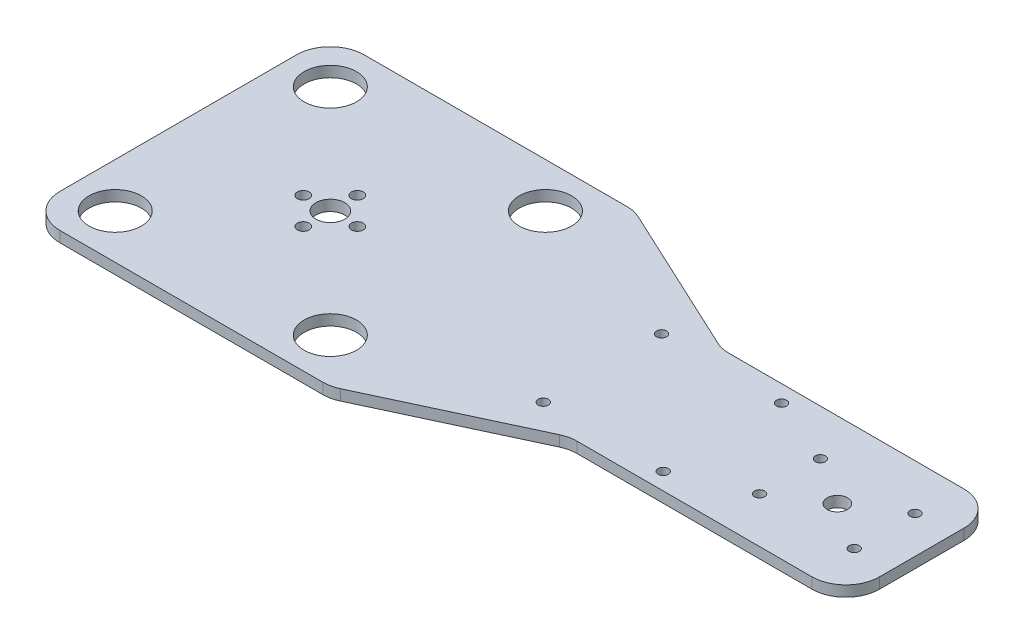
ISO-10303-21;
HEADER;
FILE_DESCRIPTION(('STEP AP214'),'2;1');
FILE_NAME('part.step','',(''),(''),'','','');
FILE_SCHEMA(('AUTOMOTIVE_DESIGN { 1 0 10303 214 1 1 1 1 }'));
ENDSEC;
DATA;
#1=APPLICATION_CONTEXT('core data for automotive mechanical design processes');
#2=APPLICATION_PROTOCOL_DEFINITION('international standard','automotive_design',2000,#1);
#3=PRODUCT_CONTEXT('',#1,'mechanical');
#4=PRODUCT('Part','Part','',(#3));
#5=PRODUCT_RELATED_PRODUCT_CATEGORY('part','',(#4));
#6=PRODUCT_DEFINITION_FORMATION('','',#4);
#7=PRODUCT_DEFINITION_CONTEXT('part definition',#1,'design');
#8=PRODUCT_DEFINITION('design','',#6,#7);
#9=PRODUCT_DEFINITION_SHAPE('','',#8);
#10=(LENGTH_UNIT() NAMED_UNIT(*) SI_UNIT(.MILLI.,.METRE.));
#11=(NAMED_UNIT(*) PLANE_ANGLE_UNIT() SI_UNIT($,.RADIAN.));
#12=(NAMED_UNIT(*) SI_UNIT($,.STERADIAN.) SOLID_ANGLE_UNIT());
#13=UNCERTAINTY_MEASURE_WITH_UNIT(LENGTH_MEASURE(1.E-05),#10,'distance_accuracy_value','');
#14=(GEOMETRIC_REPRESENTATION_CONTEXT(3) GLOBAL_UNCERTAINTY_ASSIGNED_CONTEXT((#13)) GLOBAL_UNIT_ASSIGNED_CONTEXT((#10,
#11,#12)) REPRESENTATION_CONTEXT('',''));
#15=CARTESIAN_POINT('',(0.,0.,0.));
#16=DIRECTION('',(0.,0.,1.));
#17=DIRECTION('',(1.,0.,0.));
#18=AXIS2_PLACEMENT_3D('',#15,#16,#17);
#19=CARTESIAN_POINT('',(93.2514057114654,3.175,22.5));
#20=DIRECTION('',(0.,0.,-1.));
#21=DIRECTION('',(-1.,0.,0.));
#22=AXIS2_PLACEMENT_3D('',#19,#20,#21);
#23=PLANE('',#22);
#24=DIRECTION('',(1.,0.,0.));
#25=VECTOR('',#24,1.);
#26=CARTESIAN_POINT('',(93.2514057114654,3.175,22.5));
#27=LINE('',#26,#25);
#28=CARTESIAN_POINT('',(95.4683523378948,3.175,22.5));
#29=VERTEX_POINT('',#28);
#30=CARTESIAN_POINT('',(165.,3.175,22.5));
#31=VERTEX_POINT('',#30);
#32=EDGE_CURVE('E196',#29,#31,#27,.T.);
#33=ORIENTED_EDGE('',*,*,#32,.F.);
#34=DIRECTION('',(0.,-1.,0.));
#35=VECTOR('',#34,1.);
#36=CARTESIAN_POINT('',(95.4683523378948,0.,22.5));
#37=LINE('',#36,#35);
#38=CARTESIAN_POINT('',(95.4683523378948,0.,22.5));
#39=VERTEX_POINT('',#38);
#40=EDGE_CURVE('E247',#29,#39,#37,.T.);
#41=ORIENTED_EDGE('',*,*,#40,.T.);
#42=DIRECTION('',(1.,0.,0.));
#43=VECTOR('',#42,1.);
#44=CARTESIAN_POINT('',(93.2514057114654,0.,22.5));
#45=LINE('',#44,#43);
#46=CARTESIAN_POINT('',(165.,0.,22.5));
#47=VERTEX_POINT('',#46);
#48=EDGE_CURVE('E184',#39,#47,#45,.T.);
#49=ORIENTED_EDGE('',*,*,#48,.T.);
#50=DIRECTION('',(0.,-1.,0.));
#51=VECTOR('',#50,1.);
#52=CARTESIAN_POINT('',(165.,3.175,22.5));
#53=LINE('',#52,#51);
#54=EDGE_CURVE('E215',#47,#31,#53,.F.);
#55=ORIENTED_EDGE('',*,*,#54,.T.);
#56=EDGE_LOOP('',(#33,#41,#49,#55));
#57=FACE_BOUND('',#56,.T.);
#58=ADVANCED_FACE('F37',(#57),#23,.F.);
#59=CARTESIAN_POINT('',(175.,3.175,-22.5));
#60=DIRECTION('',(-1.,0.,0.));
#61=DIRECTION('',(0.,0.,1.));
#62=AXIS2_PLACEMENT_3D('',#59,#60,#61);
#63=PLANE('',#62);
#64=DIRECTION('',(0.,0.,-1.));
#65=VECTOR('',#64,1.);
#66=CARTESIAN_POINT('',(175.,0.,-22.5));
#67=LINE('',#66,#65);
#68=CARTESIAN_POINT('',(175.,0.,12.5));
#69=VERTEX_POINT('',#68);
#70=CARTESIAN_POINT('',(175.,0.,-12.5));
#71=VERTEX_POINT('',#70);
#72=EDGE_CURVE('E179',#69,#71,#67,.T.);
#73=ORIENTED_EDGE('',*,*,#72,.T.);
#74=DIRECTION('',(0.,-1.,0.));
#75=VECTOR('',#74,1.);
#76=CARTESIAN_POINT('',(175.,3.175,-12.5));
#77=LINE('',#76,#75);
#78=CARTESIAN_POINT('',(175.,3.175,-12.5));
#79=VERTEX_POINT('',#78);
#80=EDGE_CURVE('E155',#71,#79,#77,.F.);
#81=ORIENTED_EDGE('',*,*,#80,.T.);
#82=DIRECTION('',(0.,0.,-1.));
#83=VECTOR('',#82,1.);
#84=CARTESIAN_POINT('',(175.,3.175,-22.5));
#85=LINE('',#84,#83);
#86=CARTESIAN_POINT('',(175.,3.175,12.5));
#87=VERTEX_POINT('',#86);
#88=EDGE_CURVE('E268',#87,#79,#85,.T.);
#89=ORIENTED_EDGE('',*,*,#88,.F.);
#90=DIRECTION('',(0.,-1.,0.));
#91=VECTOR('',#90,1.);
#92=CARTESIAN_POINT('',(175.,3.175,12.5));
#93=LINE('',#92,#91);
#94=EDGE_CURVE('E160',#87,#69,#93,.T.);
#95=ORIENTED_EDGE('',*,*,#94,.T.);
#96=EDGE_LOOP('',(#73,#81,#89,#95));
#97=FACE_BOUND('',#96,.T.);
#98=ADVANCED_FACE('F487',(#97),#63,.F.);
#99=CARTESIAN_POINT('',(93.2514057114654,3.175,-22.5));
#100=DIRECTION('',(0.,0.,1.));
#101=DIRECTION('',(1.,0.,0.));
#102=AXIS2_PLACEMENT_3D('',#99,#100,#101);
#103=PLANE('',#102);
#104=DIRECTION('',(-1.,0.,0.));
#105=VECTOR('',#104,1.);
#106=CARTESIAN_POINT('',(93.2514057114654,0.,-22.5));
#107=LINE('',#106,#105);
#108=CARTESIAN_POINT('',(165.,0.,-22.5));
#109=VERTEX_POINT('',#108);
#110=CARTESIAN_POINT('',(95.4683523378947,0.,-22.5));
#111=VERTEX_POINT('',#110);
#112=EDGE_CURVE('E167',#109,#111,#107,.T.);
#113=ORIENTED_EDGE('',*,*,#112,.T.);
#114=DIRECTION('',(0.,-1.,0.));
#115=VECTOR('',#114,1.);
#116=CARTESIAN_POINT('',(95.4683523378947,3.175,-22.5));
#117=LINE('',#116,#115);
#118=CARTESIAN_POINT('',(95.4683523378947,3.175,-22.5));
#119=VERTEX_POINT('',#118);
#120=EDGE_CURVE('E245',#111,#119,#117,.F.);
#121=ORIENTED_EDGE('',*,*,#120,.T.);
#122=DIRECTION('',(-1.,0.,0.));
#123=VECTOR('',#122,1.);
#124=CARTESIAN_POINT('',(93.2514057114654,3.175,-22.5));
#125=LINE('',#124,#123);
#126=CARTESIAN_POINT('',(165.,3.175,-22.5));
#127=VERTEX_POINT('',#126);
#128=EDGE_CURVE('E170',#127,#119,#125,.T.);
#129=ORIENTED_EDGE('',*,*,#128,.F.);
#130=DIRECTION('',(0.,-1.,0.));
#131=VECTOR('',#130,1.);
#132=CARTESIAN_POINT('',(165.,3.175,-22.5));
#133=LINE('',#132,#131);
#134=EDGE_CURVE('E154',#127,#109,#133,.T.);
#135=ORIENTED_EDGE('',*,*,#134,.T.);
#136=EDGE_LOOP('',(#113,#121,#129,#135));
#137=FACE_BOUND('',#136,.T.);
#138=ADVANCED_FACE('F166',(#137),#103,.F.);
#139=CARTESIAN_POINT('',(45.,3.175,-45.));
#140=DIRECTION('',(-0.422618261740697,0.,0.906307787036651));
#141=DIRECTION('',(0.906307787036651,0.,0.422618261740697));
#142=AXIS2_PLACEMENT_3D('',#139,#140,#141);
#143=PLANE('',#142);
#144=DIRECTION('',(-0.906307787036651,0.,-0.422618261740697));
#145=VECTOR('',#144,1.);
#146=CARTESIAN_POINT('',(45.,0.,-45.));
#147=LINE('',#146,#145);
#148=CARTESIAN_POINT('',(91.2421697204878,0.,-23.4369221296335));
#149=VERTEX_POINT('',#148);
#150=CARTESIAN_POINT('',(47.0092359909776,0.,-44.0630778703665));
#151=VERTEX_POINT('',#150);
#152=EDGE_CURVE('E178',#149,#151,#147,.T.);
#153=ORIENTED_EDGE('',*,*,#152,.T.);
#154=DIRECTION('',(0.,-1.,0.));
#155=VECTOR('',#154,1.);
#156=CARTESIAN_POINT('',(47.0092359909776,3.175,-44.0630778703665));
#157=LINE('',#156,#155);
#158=CARTESIAN_POINT('',(47.0092359909776,3.175,-44.0630778703665));
#159=VERTEX_POINT('',#158);
#160=EDGE_CURVE('E239',#151,#159,#157,.F.);
#161=ORIENTED_EDGE('',*,*,#160,.T.);
#162=DIRECTION('',(-0.906307787036651,0.,-0.422618261740697));
#163=VECTOR('',#162,1.);
#164=CARTESIAN_POINT('',(45.,3.175,-45.));
#165=LINE('',#164,#163);
#166=CARTESIAN_POINT('',(91.2421697204878,3.175,-23.4369221296335));
#167=VERTEX_POINT('',#166);
#168=EDGE_CURVE('E277',#167,#159,#165,.T.);
#169=ORIENTED_EDGE('',*,*,#168,.F.);
#170=DIRECTION('',(0.,-1.,0.));
#171=VECTOR('',#170,1.);
#172=CARTESIAN_POINT('',(91.2421697204878,0.,-23.4369221296335));
#173=LINE('',#172,#171);
#174=EDGE_CURVE('E236',#167,#149,#173,.T.);
#175=ORIENTED_EDGE('',*,*,#174,.T.);
#176=EDGE_LOOP('',(#153,#161,#169,#175));
#177=FACE_BOUND('',#176,.T.);
#178=ADVANCED_FACE('F513',(#177),#143,.F.);
#179=CARTESIAN_POINT('',(-45.,3.175,-45.));
#180=DIRECTION('',(0.,0.,1.));
#181=DIRECTION('',(1.,0.,0.));
#182=AXIS2_PLACEMENT_3D('',#179,#180,#181);
#183=PLANE('',#182);
#184=DIRECTION('',(-1.,0.,0.));
#185=VECTOR('',#184,1.);
#186=CARTESIAN_POINT('',(-45.,3.175,-45.));
#187=LINE('',#186,#185);
#188=CARTESIAN_POINT('',(42.7830533735706,3.175,-45.));
#189=VERTEX_POINT('',#188);
#190=CARTESIAN_POINT('',(-35.,3.175,-45.));
#191=VERTEX_POINT('',#190);
#192=EDGE_CURVE('E280',#189,#191,#187,.T.);
#193=ORIENTED_EDGE('',*,*,#192,.F.);
#194=DIRECTION('',(0.,-1.,0.));
#195=VECTOR('',#194,1.);
#196=CARTESIAN_POINT('',(42.7830533735706,3.175,-45.));
#197=LINE('',#196,#195);
#198=CARTESIAN_POINT('',(42.7830533735706,0.,-45.));
#199=VERTEX_POINT('',#198);
#200=EDGE_CURVE('E229',#189,#199,#197,.T.);
#201=ORIENTED_EDGE('',*,*,#200,.T.);
#202=DIRECTION('',(-1.,0.,0.));
#203=VECTOR('',#202,1.);
#204=CARTESIAN_POINT('',(-45.,0.,-45.));
#205=LINE('',#204,#203);
#206=CARTESIAN_POINT('',(-35.,0.,-45.));
#207=VERTEX_POINT('',#206);
#208=EDGE_CURVE('E182',#199,#207,#205,.T.);
#209=ORIENTED_EDGE('',*,*,#208,.T.);
#210=DIRECTION('',(0.,-1.,0.));
#211=VECTOR('',#210,1.);
#212=CARTESIAN_POINT('',(-35.,3.175,-45.));
#213=LINE('',#212,#211);
#214=EDGE_CURVE('E223',#207,#191,#213,.F.);
#215=ORIENTED_EDGE('',*,*,#214,.T.);
#216=EDGE_LOOP('',(#193,#201,#209,#215));
#217=FACE_BOUND('',#216,.T.);
#218=ADVANCED_FACE('F454',(#217),#183,.F.);
#219=CARTESIAN_POINT('',(-45.,3.175,45.));
#220=DIRECTION('',(1.,0.,0.));
#221=DIRECTION('',(0.,0.,-1.));
#222=AXIS2_PLACEMENT_3D('',#219,#220,#221);
#223=PLANE('',#222);
#224=DIRECTION('',(0.,0.,1.));
#225=VECTOR('',#224,1.);
#226=CARTESIAN_POINT('',(-45.,3.175,45.));
#227=LINE('',#226,#225);
#228=CARTESIAN_POINT('',(-45.,3.175,-35.));
#229=VERTEX_POINT('',#228);
#230=CARTESIAN_POINT('',(-45.,3.175,35.));
#231=VERTEX_POINT('',#230);
#232=EDGE_CURVE('E282',#229,#231,#227,.T.);
#233=ORIENTED_EDGE('',*,*,#232,.F.);
#234=DIRECTION('',(0.,-1.,0.));
#235=VECTOR('',#234,1.);
#236=CARTESIAN_POINT('',(-45.,3.175,-35.));
#237=LINE('',#236,#235);
#238=CARTESIAN_POINT('',(-45.,0.,-35.));
#239=VERTEX_POINT('',#238);
#240=EDGE_CURVE('E220',#229,#239,#237,.T.);
#241=ORIENTED_EDGE('',*,*,#240,.T.);
#242=DIRECTION('',(0.,0.,1.));
#243=VECTOR('',#242,1.);
#244=CARTESIAN_POINT('',(-45.,0.,45.));
#245=LINE('',#244,#243);
#246=CARTESIAN_POINT('',(-45.,0.,35.));
#247=VERTEX_POINT('',#246);
#248=EDGE_CURVE('E189',#239,#247,#245,.T.);
#249=ORIENTED_EDGE('',*,*,#248,.T.);
#250=DIRECTION('',(0.,-1.,0.));
#251=VECTOR('',#250,1.);
#252=CARTESIAN_POINT('',(-45.,3.175,35.));
#253=LINE('',#252,#251);
#254=EDGE_CURVE('E218',#247,#231,#253,.F.);
#255=ORIENTED_EDGE('',*,*,#254,.T.);
#256=EDGE_LOOP('',(#233,#241,#249,#255));
#257=FACE_BOUND('',#256,.T.);
#258=ADVANCED_FACE('F464',(#257),#223,.F.);
#259=CARTESIAN_POINT('',(-45.,3.175,45.));
#260=DIRECTION('',(0.,0.,-1.));
#261=DIRECTION('',(-1.,0.,0.));
#262=AXIS2_PLACEMENT_3D('',#259,#260,#261);
#263=PLANE('',#262);
#264=DIRECTION('',(1.,0.,0.));
#265=VECTOR('',#264,1.);
#266=CARTESIAN_POINT('',(-45.,0.,45.));
#267=LINE('',#266,#265);
#268=CARTESIAN_POINT('',(-35.,0.,45.));
#269=VERTEX_POINT('',#268);
#270=CARTESIAN_POINT('',(42.7830533735706,0.,45.));
#271=VERTEX_POINT('',#270);
#272=EDGE_CURVE('E192',#269,#271,#267,.T.);
#273=ORIENTED_EDGE('',*,*,#272,.T.);
#274=DIRECTION('',(0.,-1.,0.));
#275=VECTOR('',#274,1.);
#276=CARTESIAN_POINT('',(42.7830533735706,3.175,45.));
#277=LINE('',#276,#275);
#278=CARTESIAN_POINT('',(42.7830533735706,3.175,45.));
#279=VERTEX_POINT('',#278);
#280=EDGE_CURVE('E254',#271,#279,#277,.F.);
#281=ORIENTED_EDGE('',*,*,#280,.T.);
#282=DIRECTION('',(1.,0.,0.));
#283=VECTOR('',#282,1.);
#284=CARTESIAN_POINT('',(-45.,3.175,45.));
#285=LINE('',#284,#283);
#286=CARTESIAN_POINT('',(-35.,3.175,45.));
#287=VERTEX_POINT('',#286);
#288=EDGE_CURVE('E285',#287,#279,#285,.T.);
#289=ORIENTED_EDGE('',*,*,#288,.F.);
#290=DIRECTION('',(0.,-1.,0.));
#291=VECTOR('',#290,1.);
#292=CARTESIAN_POINT('',(-35.,3.175,45.));
#293=LINE('',#292,#291);
#294=EDGE_CURVE('E226',#287,#269,#293,.T.);
#295=ORIENTED_EDGE('',*,*,#294,.T.);
#296=EDGE_LOOP('',(#273,#281,#289,#295));
#297=FACE_BOUND('',#296,.T.);
#298=ADVANCED_FACE('F472',(#297),#263,.F.);
#299=CARTESIAN_POINT('',(45.,3.175,45.));
#300=DIRECTION('',(-0.422618261740697,0.,-0.906307787036651));
#301=DIRECTION('',(-0.906307787036651,0.,0.422618261740697));
#302=AXIS2_PLACEMENT_3D('',#299,#300,#301);
#303=PLANE('',#302);
#304=DIRECTION('',(0.906307787036651,0.,-0.422618261740697));
#305=VECTOR('',#304,1.);
#306=CARTESIAN_POINT('',(45.,0.,45.));
#307=LINE('',#306,#305);
#308=CARTESIAN_POINT('',(47.0092359909776,0.,44.0630778703665));
#309=VERTEX_POINT('',#308);
#310=CARTESIAN_POINT('',(91.2421697204878,0.,23.4369221296335));
#311=VERTEX_POINT('',#310);
#312=EDGE_CURVE('E195',#309,#311,#307,.T.);
#313=ORIENTED_EDGE('',*,*,#312,.T.);
#314=DIRECTION('',(0.,-1.,0.));
#315=VECTOR('',#314,1.);
#316=CARTESIAN_POINT('',(91.2421697204878,3.175,23.4369221296335));
#317=LINE('',#316,#315);
#318=CARTESIAN_POINT('',(91.2421697204878,3.175,23.4369221296335));
#319=VERTEX_POINT('',#318);
#320=EDGE_CURVE('E58',#311,#319,#317,.F.);
#321=ORIENTED_EDGE('',*,*,#320,.T.);
#322=DIRECTION('',(0.906307787036651,0.,-0.422618261740697));
#323=VECTOR('',#322,1.);
#324=CARTESIAN_POINT('',(45.,3.175,45.));
#325=LINE('',#324,#323);
#326=CARTESIAN_POINT('',(47.0092359909776,3.175,44.0630778703665));
#327=VERTEX_POINT('',#326);
#328=EDGE_CURVE('E172',#327,#319,#325,.T.);
#329=ORIENTED_EDGE('',*,*,#328,.F.);
#330=DIRECTION('',(0.,-1.,0.));
#331=VECTOR('',#330,1.);
#332=CARTESIAN_POINT('',(47.0092359909776,3.175,44.0630778703665));
#333=LINE('',#332,#331);
#334=EDGE_CURVE('E250',#327,#309,#333,.T.);
#335=ORIENTED_EDGE('',*,*,#334,.T.);
#336=EDGE_LOOP('',(#313,#321,#329,#335));
#337=FACE_BOUND('',#336,.T.);
#338=ADVANCED_FACE('F262',(#337),#303,.F.);
#339=CARTESIAN_POINT('',(0.,3.175,0.));
#340=DIRECTION('',(0.,-1.,0.));
#341=DIRECTION('',(0.,0.,-1.));
#342=AXIS2_PLACEMENT_3D('',#339,#340,#341);
#343=PLANE('',#342);
#344=CARTESIAN_POINT('',(8.,3.175,0.));
#345=DIRECTION('',(0.,1.,0.));
#346=DIRECTION('',(0.,0.,1.));
#347=AXIS2_PLACEMENT_3D('',#344,#345,#346);
#348=CIRCLE('',#347,1.75);
#349=CARTESIAN_POINT('',(8.,3.175,1.75));
#350=VERTEX_POINT('',#349);
#351=EDGE_CURVE('E391',#350,#350,#348,.T.);
#352=ORIENTED_EDGE('',*,*,#351,.F.);
#353=EDGE_LOOP('',(#352));
#354=FACE_BOUND('',#353,.T.);
#355=CARTESIAN_POINT('',(0.,3.175,8.));
#356=DIRECTION('',(0.,1.,0.));
#357=DIRECTION('',(0.,0.,1.));
#358=AXIS2_PLACEMENT_3D('',#355,#356,#357);
#359=CIRCLE('',#358,1.75);
#360=CARTESIAN_POINT('',(0.,3.175,9.75));
#361=VERTEX_POINT('',#360);
#362=EDGE_CURVE('E385',#361,#361,#359,.T.);
#363=ORIENTED_EDGE('',*,*,#362,.F.);
#364=EDGE_LOOP('',(#363));
#365=FACE_BOUND('',#364,.T.);
#366=CARTESIAN_POINT('',(-8.,3.175,0.));
#367=DIRECTION('',(0.,1.,0.));
#368=DIRECTION('',(0.,0.,1.));
#369=AXIS2_PLACEMENT_3D('',#366,#367,#368);
#370=CIRCLE('',#369,1.75);
#371=CARTESIAN_POINT('',(-8.,3.175,1.74999999999994));
#372=VERTEX_POINT('',#371);
#373=EDGE_CURVE('E379',#372,#372,#370,.T.);
#374=ORIENTED_EDGE('',*,*,#373,.F.);
#375=EDGE_LOOP('',(#374));
#376=FACE_BOUND('',#375,.T.);
#377=CARTESIAN_POINT('',(0.,3.175,-8.));
#378=DIRECTION('',(0.,1.,0.));
#379=DIRECTION('',(0.,0.,1.));
#380=AXIS2_PLACEMENT_3D('',#377,#378,#379);
#381=CIRCLE('',#380,1.75);
#382=CARTESIAN_POINT('',(0.,3.175,-6.25));
#383=VERTEX_POINT('',#382);
#384=EDGE_CURVE('E373',#383,#383,#381,.T.);
#385=ORIENTED_EDGE('',*,*,#384,.F.);
#386=EDGE_LOOP('',(#385));
#387=FACE_BOUND('',#386,.T.);
#388=CARTESIAN_POINT('',(-31.8198051533946,3.175,31.8198051533945));
#389=DIRECTION('',(0.,1.,0.));
#390=DIRECTION('',(0.,0.,1.));
#391=AXIS2_PLACEMENT_3D('',#388,#389,#390);
#392=CIRCLE('',#391,7.75);
#393=CARTESIAN_POINT('',(-31.8198051533946,3.175,39.5698051533945));
#394=VERTEX_POINT('',#393);
#395=EDGE_CURVE('E355',#394,#394,#392,.T.);
#396=ORIENTED_EDGE('',*,*,#395,.F.);
#397=EDGE_LOOP('',(#396));
#398=FACE_BOUND('',#397,.T.);
#399=CARTESIAN_POINT('',(31.8198051533945,3.175,31.8198051533948));
#400=DIRECTION('',(0.,1.,0.));
#401=DIRECTION('',(0.,0.,1.));
#402=AXIS2_PLACEMENT_3D('',#399,#400,#401);
#403=CIRCLE('',#402,7.75);
#404=CARTESIAN_POINT('',(31.8198051533945,3.175,39.5698051533948));
#405=VERTEX_POINT('',#404);
#406=EDGE_CURVE('E362',#405,#405,#403,.T.);
#407=ORIENTED_EDGE('',*,*,#406,.F.);
#408=EDGE_LOOP('',(#407));
#409=FACE_BOUND('',#408,.T.);
#410=CARTESIAN_POINT('',(31.8198051533948,3.175,-31.8198051533946));
#411=DIRECTION('',(0.,1.,0.));
#412=DIRECTION('',(0.,0.,1.));
#413=AXIS2_PLACEMENT_3D('',#410,#411,#412);
#414=CIRCLE('',#413,7.75);
#415=CARTESIAN_POINT('',(31.8198051533948,3.175,-24.0698051533946));
#416=VERTEX_POINT('',#415);
#417=EDGE_CURVE('E368',#416,#416,#414,.T.);
#418=ORIENTED_EDGE('',*,*,#417,.F.);
#419=EDGE_LOOP('',(#418));
#420=FACE_BOUND('',#419,.T.);
#421=CARTESIAN_POINT('',(-31.8198051533945,3.175,-31.8198051533948));
#422=DIRECTION('',(0.,1.,0.));
#423=DIRECTION('',(0.,0.,1.));
#424=AXIS2_PLACEMENT_3D('',#421,#422,#423);
#425=CIRCLE('',#424,7.75);
#426=CARTESIAN_POINT('',(-31.8198051533945,3.175,-24.0698051533948));
#427=VERTEX_POINT('',#426);
#428=EDGE_CURVE('E349',#427,#427,#425,.T.);
#429=ORIENTED_EDGE('',*,*,#428,.F.);
#430=EDGE_LOOP('',(#429));
#431=FACE_BOUND('',#430,.T.);
#432=CARTESIAN_POINT('',(80.5,3.175,-17.5));
#433=DIRECTION('',(0.,1.,0.));
#434=DIRECTION('',(0.,0.,-1.));
#435=AXIS2_PLACEMENT_3D('',#432,#433,#434);
#436=CIRCLE('',#435,1.5);
#437=CARTESIAN_POINT('',(80.5,3.175,-19.));
#438=VERTEX_POINT('',#437);
#439=EDGE_CURVE('E331',#438,#438,#436,.T.);
#440=ORIENTED_EDGE('',*,*,#439,.F.);
#441=EDGE_LOOP('',(#440));
#442=FACE_BOUND('',#441,.T.);
#443=CARTESIAN_POINT('',(116.,3.175,-17.5));
#444=DIRECTION('',(0.,1.,0.));
#445=DIRECTION('',(0.,0.,-1.));
#446=AXIS2_PLACEMENT_3D('',#443,#444,#445);
#447=CIRCLE('',#446,1.5);
#448=CARTESIAN_POINT('',(116.,3.175,-19.));
#449=VERTEX_POINT('',#448);
#450=EDGE_CURVE('E338',#449,#449,#447,.T.);
#451=ORIENTED_EDGE('',*,*,#450,.F.);
#452=EDGE_LOOP('',(#451));
#453=FACE_BOUND('',#452,.T.);
#454=CARTESIAN_POINT('',(116.,3.175,17.5));
#455=DIRECTION('',(0.,1.,0.));
#456=DIRECTION('',(0.,0.,1.));
#457=AXIS2_PLACEMENT_3D('',#454,#455,#456);
#458=CIRCLE('',#457,1.5);
#459=CARTESIAN_POINT('',(116.,3.175,19.));
#460=VERTEX_POINT('',#459);
#461=EDGE_CURVE('E344',#460,#460,#458,.T.);
#462=ORIENTED_EDGE('',*,*,#461,.F.);
#463=EDGE_LOOP('',(#462));
#464=FACE_BOUND('',#463,.T.);
#465=CARTESIAN_POINT('',(80.5,3.175,17.5));
#466=DIRECTION('',(0.,1.,0.));
#467=DIRECTION('',(0.,0.,1.));
#468=AXIS2_PLACEMENT_3D('',#465,#466,#467);
#469=CIRCLE('',#468,1.5);
#470=CARTESIAN_POINT('',(80.5,3.175,19.));
#471=VERTEX_POINT('',#470);
#472=EDGE_CURVE('E325',#471,#471,#469,.T.);
#473=ORIENTED_EDGE('',*,*,#472,.F.);
#474=EDGE_LOOP('',(#473));
#475=FACE_BOUND('',#474,.T.);
#476=CARTESIAN_POINT('',(0.,3.175,0.));
#477=DIRECTION('',(0.,1.,0.));
#478=DIRECTION('',(0.,0.,1.));
#479=AXIS2_PLACEMENT_3D('',#476,#477,#478);
#480=CIRCLE('',#479,4.25);
#481=CARTESIAN_POINT('',(0.,3.175,4.25));
#482=VERTEX_POINT('',#481);
#483=EDGE_CURVE('E319',#482,#482,#480,.T.);
#484=ORIENTED_EDGE('',*,*,#483,.F.);
#485=EDGE_LOOP('',(#484));
#486=FACE_BOUND('',#485,.T.);
#487=CARTESIAN_POINT('',(136.,3.175,9.));
#488=DIRECTION('',(0.,1.,0.));
#489=DIRECTION('',(0.,0.,-1.));
#490=AXIS2_PLACEMENT_3D('',#487,#488,#489);
#491=CIRCLE('',#490,1.5);
#492=CARTESIAN_POINT('',(136.,3.175,7.5));
#493=VERTEX_POINT('',#492);
#494=EDGE_CURVE('E295',#493,#493,#491,.T.);
#495=ORIENTED_EDGE('',*,*,#494,.F.);
#496=EDGE_LOOP('',(#495));
#497=FACE_BOUND('',#496,.T.);
#498=CARTESIAN_POINT('',(164.,3.175,9.));
#499=DIRECTION('',(0.,1.,0.));
#500=DIRECTION('',(0.,0.,1.));
#501=AXIS2_PLACEMENT_3D('',#498,#499,#500);
#502=CIRCLE('',#501,1.50000000000003);
#503=CARTESIAN_POINT('',(164.,3.175,10.5));
#504=VERTEX_POINT('',#503);
#505=EDGE_CURVE('E302',#504,#504,#502,.T.);
#506=ORIENTED_EDGE('',*,*,#505,.F.);
#507=EDGE_LOOP('',(#506));
#508=FACE_BOUND('',#507,.T.);
#509=CARTESIAN_POINT('',(164.,3.175,-9.));
#510=DIRECTION('',(0.,1.,0.));
#511=DIRECTION('',(0.,0.,-1.));
#512=AXIS2_PLACEMENT_3D('',#509,#510,#511);
#513=CIRCLE('',#512,1.50000000000003);
#514=CARTESIAN_POINT('',(164.,3.175,-10.5));
#515=VERTEX_POINT('',#514);
#516=EDGE_CURVE('E308',#515,#515,#513,.T.);
#517=ORIENTED_EDGE('',*,*,#516,.F.);
#518=EDGE_LOOP('',(#517));
#519=FACE_BOUND('',#518,.T.);
#520=CARTESIAN_POINT('',(136.,3.175,-9.));
#521=DIRECTION('',(0.,1.,0.));
#522=DIRECTION('',(0.,0.,1.));
#523=AXIS2_PLACEMENT_3D('',#520,#521,#522);
#524=CIRCLE('',#523,1.5);
#525=CARTESIAN_POINT('',(136.,3.175,-7.5));
#526=VERTEX_POINT('',#525);
#527=EDGE_CURVE('E314',#526,#526,#524,.T.);
#528=ORIENTED_EDGE('',*,*,#527,.F.);
#529=EDGE_LOOP('',(#528));
#530=FACE_BOUND('',#529,.T.);
#531=CARTESIAN_POINT('',(150.,3.175,0.));
#532=DIRECTION('',(0.,1.,0.));
#533=DIRECTION('',(0.,0.,1.));
#534=AXIS2_PLACEMENT_3D('',#531,#532,#533);
#535=CIRCLE('',#534,2.99999999999999);
#536=CARTESIAN_POINT('',(150.,3.175,2.99999999999999));
#537=VERTEX_POINT('',#536);
#538=EDGE_CURVE('E273',#537,#537,#535,.T.);
#539=ORIENTED_EDGE('',*,*,#538,.F.);
#540=EDGE_LOOP('',(#539));
#541=FACE_BOUND('',#540,.T.);
#542=ORIENTED_EDGE('',*,*,#168,.T.);
#543=CARTESIAN_POINT('',(42.7830533735706,3.175,-35.));
#544=DIRECTION('',(0.,-1.,0.));
#545=DIRECTION('',(0.,0.,-1.));
#546=AXIS2_PLACEMENT_3D('',#543,#544,#545);
#547=CIRCLE('',#546,10.);
#548=EDGE_CURVE('E243',#159,#189,#547,.F.);
#549=ORIENTED_EDGE('',*,*,#548,.T.);
#550=ORIENTED_EDGE('',*,*,#192,.T.);
#551=CARTESIAN_POINT('',(-35.,3.175,-35.));
#552=DIRECTION('',(0.,-1.,0.));
#553=DIRECTION('',(0.,0.,-1.));
#554=AXIS2_PLACEMENT_3D('',#551,#552,#553);
#555=CIRCLE('',#554,10.);
#556=EDGE_CURVE('E209',#191,#229,#555,.F.);
#557=ORIENTED_EDGE('',*,*,#556,.T.);
#558=ORIENTED_EDGE('',*,*,#232,.T.);
#559=CARTESIAN_POINT('',(-35.,3.175,35.));
#560=DIRECTION('',(0.,-1.,0.));
#561=DIRECTION('',(0.,0.,-1.));
#562=AXIS2_PLACEMENT_3D('',#559,#560,#561);
#563=CIRCLE('',#562,10.);
#564=EDGE_CURVE('E207',#231,#287,#563,.F.);
#565=ORIENTED_EDGE('',*,*,#564,.T.);
#566=ORIENTED_EDGE('',*,*,#288,.T.);
#567=CARTESIAN_POINT('',(42.7830533735706,3.175,35.));
#568=DIRECTION('',(0.,-1.,0.));
#569=DIRECTION('',(0.,0.,-1.));
#570=AXIS2_PLACEMENT_3D('',#567,#568,#569);
#571=CIRCLE('',#570,10.);
#572=EDGE_CURVE('E241',#279,#327,#571,.F.);
#573=ORIENTED_EDGE('',*,*,#572,.T.);
#574=ORIENTED_EDGE('',*,*,#328,.T.);
#575=CARTESIAN_POINT('',(95.4683523378948,3.175,32.5));
#576=DIRECTION('',(0.,-1.,0.));
#577=DIRECTION('',(0.,0.,-1.));
#578=AXIS2_PLACEMENT_3D('',#575,#576,#577);
#579=CIRCLE('',#578,10.);
#580=EDGE_CURVE('E11',#319,#29,#579,.T.);
#581=ORIENTED_EDGE('',*,*,#580,.T.);
#582=ORIENTED_EDGE('',*,*,#32,.T.);
#583=CARTESIAN_POINT('',(165.,3.175,12.5));
#584=DIRECTION('',(0.,-1.,0.));
#585=DIRECTION('',(0.,0.,-1.));
#586=AXIS2_PLACEMENT_3D('',#583,#584,#585);
#587=CIRCLE('',#586,10.);
#588=EDGE_CURVE('E211',#31,#87,#587,.F.);
#589=ORIENTED_EDGE('',*,*,#588,.T.);
#590=ORIENTED_EDGE('',*,*,#88,.T.);
#591=CARTESIAN_POINT('',(165.,3.175,-12.5));
#592=DIRECTION('',(0.,-1.,0.));
#593=DIRECTION('',(0.,0.,-1.));
#594=AXIS2_PLACEMENT_3D('',#591,#592,#593);
#595=CIRCLE('',#594,10.);
#596=EDGE_CURVE('E213',#79,#127,#595,.F.);
#597=ORIENTED_EDGE('',*,*,#596,.T.);
#598=ORIENTED_EDGE('',*,*,#128,.T.);
#599=CARTESIAN_POINT('',(95.4683523378947,3.175,-32.5));
#600=DIRECTION('',(0.,-1.,0.));
#601=DIRECTION('',(0.,0.,-1.));
#602=AXIS2_PLACEMENT_3D('',#599,#600,#601);
#603=CIRCLE('',#602,10.);
#604=EDGE_CURVE('E257',#119,#167,#603,.T.);
#605=ORIENTED_EDGE('',*,*,#604,.T.);
#606=EDGE_LOOP('',(#542,#549,#550,#557,#558,#565,#566,#573,#574,#581,#582,#589,#590,#597,#598,#605));
#607=FACE_BOUND('',#606,.T.);
#608=ADVANCED_FACE('F406',(#354,#365,#376,#387,#398,#409,#420,#431,#442,#453,#464,#475,#486,
#497,#508,#519,#530,#541,#607),#343,.F.);
#609=CARTESIAN_POINT('',(0.,0.,0.));
#610=DIRECTION('',(0.,-1.,0.));
#611=DIRECTION('',(0.,0.,-1.));
#612=AXIS2_PLACEMENT_3D('',#609,#610,#611);
#613=PLANE('',#612);
#614=CARTESIAN_POINT('',(8.,0.,0.));
#615=DIRECTION('',(0.,1.,0.));
#616=DIRECTION('',(0.,0.,1.));
#617=AXIS2_PLACEMENT_3D('',#614,#615,#616);
#618=CIRCLE('',#617,1.75);
#619=CARTESIAN_POINT('',(8.,0.,1.75));
#620=VERTEX_POINT('',#619);
#621=EDGE_CURVE('E359',#620,#620,#618,.T.);
#622=ORIENTED_EDGE('',*,*,#621,.T.);
#623=EDGE_LOOP('',(#622));
#624=FACE_BOUND('',#623,.T.);
#625=CARTESIAN_POINT('',(0.,0.,8.));
#626=DIRECTION('',(0.,1.,0.));
#627=DIRECTION('',(0.,0.,1.));
#628=AXIS2_PLACEMENT_3D('',#625,#626,#627);
#629=CIRCLE('',#628,1.75);
#630=CARTESIAN_POINT('',(0.,0.,9.75));
#631=VERTEX_POINT('',#630);
#632=EDGE_CURVE('E388',#631,#631,#629,.T.);
#633=ORIENTED_EDGE('',*,*,#632,.T.);
#634=EDGE_LOOP('',(#633));
#635=FACE_BOUND('',#634,.T.);
#636=CARTESIAN_POINT('',(-8.,0.,0.));
#637=DIRECTION('',(0.,1.,0.));
#638=DIRECTION('',(0.,0.,1.));
#639=AXIS2_PLACEMENT_3D('',#636,#637,#638);
#640=CIRCLE('',#639,1.75);
#641=CARTESIAN_POINT('',(-8.,0.,1.74999999999994));
#642=VERTEX_POINT('',#641);
#643=EDGE_CURVE('E382',#642,#642,#640,.T.);
#644=ORIENTED_EDGE('',*,*,#643,.T.);
#645=EDGE_LOOP('',(#644));
#646=FACE_BOUND('',#645,.T.);
#647=CARTESIAN_POINT('',(0.,0.,-8.));
#648=DIRECTION('',(0.,1.,0.));
#649=DIRECTION('',(0.,0.,1.));
#650=AXIS2_PLACEMENT_3D('',#647,#648,#649);
#651=CIRCLE('',#650,1.75);
#652=CARTESIAN_POINT('',(0.,0.,-6.25));
#653=VERTEX_POINT('',#652);
#654=EDGE_CURVE('E376',#653,#653,#651,.T.);
#655=ORIENTED_EDGE('',*,*,#654,.T.);
#656=EDGE_LOOP('',(#655));
#657=FACE_BOUND('',#656,.T.);
#658=CARTESIAN_POINT('',(-31.8198051533946,0.,31.8198051533945));
#659=DIRECTION('',(0.,1.,0.));
#660=DIRECTION('',(0.,0.,1.));
#661=AXIS2_PLACEMENT_3D('',#658,#659,#660);
#662=CIRCLE('',#661,7.75);
#663=CARTESIAN_POINT('',(-31.8198051533946,0.,39.5698051533945));
#664=VERTEX_POINT('',#663);
#665=EDGE_CURVE('E358',#664,#664,#662,.T.);
#666=ORIENTED_EDGE('',*,*,#665,.T.);
#667=EDGE_LOOP('',(#666));
#668=FACE_BOUND('',#667,.T.);
#669=CARTESIAN_POINT('',(31.8198051533945,0.,31.8198051533948));
#670=DIRECTION('',(0.,1.,0.));
#671=DIRECTION('',(0.,0.,1.));
#672=AXIS2_PLACEMENT_3D('',#669,#670,#671);
#673=CIRCLE('',#672,7.75);
#674=CARTESIAN_POINT('',(31.8198051533945,0.,39.5698051533948));
#675=VERTEX_POINT('',#674);
#676=EDGE_CURVE('E365',#675,#675,#673,.T.);
#677=ORIENTED_EDGE('',*,*,#676,.T.);
#678=EDGE_LOOP('',(#677));
#679=FACE_BOUND('',#678,.T.);
#680=CARTESIAN_POINT('',(31.8198051533948,0.,-31.8198051533946));
#681=DIRECTION('',(0.,1.,0.));
#682=DIRECTION('',(0.,0.,1.));
#683=AXIS2_PLACEMENT_3D('',#680,#681,#682);
#684=CIRCLE('',#683,7.75);
#685=CARTESIAN_POINT('',(31.8198051533948,0.,-24.0698051533946));
#686=VERTEX_POINT('',#685);
#687=EDGE_CURVE('E352',#686,#686,#684,.T.);
#688=ORIENTED_EDGE('',*,*,#687,.T.);
#689=EDGE_LOOP('',(#688));
#690=FACE_BOUND('',#689,.T.);
#691=CARTESIAN_POINT('',(-31.8198051533945,0.,-31.8198051533948));
#692=DIRECTION('',(0.,1.,0.));
#693=DIRECTION('',(0.,0.,1.));
#694=AXIS2_PLACEMENT_3D('',#691,#692,#693);
#695=CIRCLE('',#694,7.75);
#696=CARTESIAN_POINT('',(-31.8198051533945,0.,-24.0698051533948));
#697=VERTEX_POINT('',#696);
#698=EDGE_CURVE('E335',#697,#697,#695,.T.);
#699=ORIENTED_EDGE('',*,*,#698,.T.);
#700=EDGE_LOOP('',(#699));
#701=FACE_BOUND('',#700,.T.);
#702=CARTESIAN_POINT('',(80.5,0.,-17.5));
#703=DIRECTION('',(0.,1.,0.));
#704=DIRECTION('',(0.,0.,-1.));
#705=AXIS2_PLACEMENT_3D('',#702,#703,#704);
#706=CIRCLE('',#705,1.5);
#707=CARTESIAN_POINT('',(80.5,0.,-19.));
#708=VERTEX_POINT('',#707);
#709=EDGE_CURVE('E334',#708,#708,#706,.T.);
#710=ORIENTED_EDGE('',*,*,#709,.T.);
#711=EDGE_LOOP('',(#710));
#712=FACE_BOUND('',#711,.T.);
#713=CARTESIAN_POINT('',(116.,0.,-17.5));
#714=DIRECTION('',(0.,1.,0.));
#715=DIRECTION('',(0.,0.,-1.));
#716=AXIS2_PLACEMENT_3D('',#713,#714,#715);
#717=CIRCLE('',#716,1.5);
#718=CARTESIAN_POINT('',(116.,0.,-19.));
#719=VERTEX_POINT('',#718);
#720=EDGE_CURVE('E341',#719,#719,#717,.T.);
#721=ORIENTED_EDGE('',*,*,#720,.T.);
#722=EDGE_LOOP('',(#721));
#723=FACE_BOUND('',#722,.T.);
#724=CARTESIAN_POINT('',(116.,0.,17.5));
#725=DIRECTION('',(0.,1.,0.));
#726=DIRECTION('',(0.,0.,1.));
#727=AXIS2_PLACEMENT_3D('',#724,#725,#726);
#728=CIRCLE('',#727,1.5);
#729=CARTESIAN_POINT('',(116.,0.,19.));
#730=VERTEX_POINT('',#729);
#731=EDGE_CURVE('E328',#730,#730,#728,.T.);
#732=ORIENTED_EDGE('',*,*,#731,.T.);
#733=EDGE_LOOP('',(#732));
#734=FACE_BOUND('',#733,.T.);
#735=CARTESIAN_POINT('',(80.5,0.,17.5));
#736=DIRECTION('',(0.,1.,0.));
#737=DIRECTION('',(0.,0.,1.));
#738=AXIS2_PLACEMENT_3D('',#735,#736,#737);
#739=CIRCLE('',#738,1.5);
#740=CARTESIAN_POINT('',(80.5,0.,19.));
#741=VERTEX_POINT('',#740);
#742=EDGE_CURVE('E322',#741,#741,#739,.T.);
#743=ORIENTED_EDGE('',*,*,#742,.T.);
#744=EDGE_LOOP('',(#743));
#745=FACE_BOUND('',#744,.T.);
#746=CARTESIAN_POINT('',(0.,0.,0.));
#747=DIRECTION('',(0.,1.,0.));
#748=DIRECTION('',(0.,0.,1.));
#749=AXIS2_PLACEMENT_3D('',#746,#747,#748);
#750=CIRCLE('',#749,4.25);
#751=CARTESIAN_POINT('',(0.,0.,4.25));
#752=VERTEX_POINT('',#751);
#753=EDGE_CURVE('E299',#752,#752,#750,.T.);
#754=ORIENTED_EDGE('',*,*,#753,.T.);
#755=EDGE_LOOP('',(#754));
#756=FACE_BOUND('',#755,.T.);
#757=CARTESIAN_POINT('',(136.,0.,9.));
#758=DIRECTION('',(0.,1.,0.));
#759=DIRECTION('',(0.,0.,-1.));
#760=AXIS2_PLACEMENT_3D('',#757,#758,#759);
#761=CIRCLE('',#760,1.5);
#762=CARTESIAN_POINT('',(136.,0.,7.5));
#763=VERTEX_POINT('',#762);
#764=EDGE_CURVE('E298',#763,#763,#761,.T.);
#765=ORIENTED_EDGE('',*,*,#764,.T.);
#766=EDGE_LOOP('',(#765));
#767=FACE_BOUND('',#766,.T.);
#768=CARTESIAN_POINT('',(164.,0.,9.));
#769=DIRECTION('',(0.,1.,0.));
#770=DIRECTION('',(0.,0.,1.));
#771=AXIS2_PLACEMENT_3D('',#768,#769,#770);
#772=CIRCLE('',#771,1.50000000000003);
#773=CARTESIAN_POINT('',(164.,0.,10.5));
#774=VERTEX_POINT('',#773);
#775=EDGE_CURVE('E305',#774,#774,#772,.T.);
#776=ORIENTED_EDGE('',*,*,#775,.T.);
#777=EDGE_LOOP('',(#776));
#778=FACE_BOUND('',#777,.T.);
#779=CARTESIAN_POINT('',(164.,0.,-9.));
#780=DIRECTION('',(0.,1.,0.));
#781=DIRECTION('',(0.,0.,-1.));
#782=AXIS2_PLACEMENT_3D('',#779,#780,#781);
#783=CIRCLE('',#782,1.50000000000003);
#784=CARTESIAN_POINT('',(164.,0.,-10.5));
#785=VERTEX_POINT('',#784);
#786=EDGE_CURVE('E311',#785,#785,#783,.T.);
#787=ORIENTED_EDGE('',*,*,#786,.T.);
#788=EDGE_LOOP('',(#787));
#789=FACE_BOUND('',#788,.T.);
#790=CARTESIAN_POINT('',(136.,0.,-9.));
#791=DIRECTION('',(0.,1.,0.));
#792=DIRECTION('',(0.,0.,1.));
#793=AXIS2_PLACEMENT_3D('',#790,#791,#792);
#794=CIRCLE('',#793,1.5);
#795=CARTESIAN_POINT('',(136.,0.,-7.5));
#796=VERTEX_POINT('',#795);
#797=EDGE_CURVE('E293',#796,#796,#794,.T.);
#798=ORIENTED_EDGE('',*,*,#797,.T.);
#799=EDGE_LOOP('',(#798));
#800=FACE_BOUND('',#799,.T.);
#801=CARTESIAN_POINT('',(150.,0.,0.));
#802=DIRECTION('',(0.,1.,0.));
#803=DIRECTION('',(0.,0.,1.));
#804=AXIS2_PLACEMENT_3D('',#801,#802,#803);
#805=CIRCLE('',#804,2.99999999999999);
#806=CARTESIAN_POINT('',(150.,0.,2.99999999999999));
#807=VERTEX_POINT('',#806);
#808=EDGE_CURVE('E288',#807,#807,#805,.T.);
#809=ORIENTED_EDGE('',*,*,#808,.T.);
#810=EDGE_LOOP('',(#809));
#811=FACE_BOUND('',#810,.T.);
#812=ORIENTED_EDGE('',*,*,#208,.F.);
#813=CARTESIAN_POINT('',(42.7830533735706,0.,-35.));
#814=DIRECTION('',(0.,-1.,0.));
#815=DIRECTION('',(0.,0.,-1.));
#816=AXIS2_PLACEMENT_3D('',#813,#814,#815);
#817=CIRCLE('',#816,10.);
#818=EDGE_CURVE('E234',#199,#151,#817,.T.);
#819=ORIENTED_EDGE('',*,*,#818,.T.);
#820=ORIENTED_EDGE('',*,*,#152,.F.);
#821=CARTESIAN_POINT('',(95.4683523378947,0.,-32.5));
#822=DIRECTION('',(0.,-1.,0.));
#823=DIRECTION('',(0.,0.,-1.));
#824=AXIS2_PLACEMENT_3D('',#821,#822,#823);
#825=CIRCLE('',#824,10.);
#826=EDGE_CURVE('E177',#149,#111,#825,.F.);
#827=ORIENTED_EDGE('',*,*,#826,.T.);
#828=ORIENTED_EDGE('',*,*,#112,.F.);
#829=CARTESIAN_POINT('',(165.,0.,-12.5));
#830=DIRECTION('',(0.,-1.,0.));
#831=DIRECTION('',(0.,0.,-1.));
#832=AXIS2_PLACEMENT_3D('',#829,#830,#831);
#833=CIRCLE('',#832,10.);
#834=EDGE_CURVE('E150',#109,#71,#833,.T.);
#835=ORIENTED_EDGE('',*,*,#834,.T.);
#836=ORIENTED_EDGE('',*,*,#72,.F.);
#837=CARTESIAN_POINT('',(165.,0.,12.5));
#838=DIRECTION('',(0.,-1.,0.));
#839=DIRECTION('',(0.,0.,-1.));
#840=AXIS2_PLACEMENT_3D('',#837,#838,#839);
#841=CIRCLE('',#840,10.);
#842=EDGE_CURVE('E161',#69,#47,#841,.T.);
#843=ORIENTED_EDGE('',*,*,#842,.T.);
#844=ORIENTED_EDGE('',*,*,#48,.F.);
#845=CARTESIAN_POINT('',(95.4683523378948,0.,32.5));
#846=DIRECTION('',(0.,-1.,0.));
#847=DIRECTION('',(0.,0.,-1.));
#848=AXIS2_PLACEMENT_3D('',#845,#846,#847);
#849=CIRCLE('',#848,10.);
#850=EDGE_CURVE('E45',#39,#311,#849,.F.);
#851=ORIENTED_EDGE('',*,*,#850,.T.);
#852=ORIENTED_EDGE('',*,*,#312,.F.);
#853=CARTESIAN_POINT('',(42.7830533735706,0.,35.));
#854=DIRECTION('',(0.,-1.,0.));
#855=DIRECTION('',(0.,0.,-1.));
#856=AXIS2_PLACEMENT_3D('',#853,#854,#855);
#857=CIRCLE('',#856,10.);
#858=EDGE_CURVE('E232',#309,#271,#857,.T.);
#859=ORIENTED_EDGE('',*,*,#858,.T.);
#860=ORIENTED_EDGE('',*,*,#272,.F.);
#861=CARTESIAN_POINT('',(-35.,0.,35.));
#862=DIRECTION('',(0.,-1.,0.));
#863=DIRECTION('',(0.,0.,-1.));
#864=AXIS2_PLACEMENT_3D('',#861,#862,#863);
#865=CIRCLE('',#864,10.);
#866=EDGE_CURVE('E171',#269,#247,#865,.T.);
#867=ORIENTED_EDGE('',*,*,#866,.T.);
#868=ORIENTED_EDGE('',*,*,#248,.F.);
#869=CARTESIAN_POINT('',(-35.,0.,-35.));
#870=DIRECTION('',(0.,-1.,0.));
#871=DIRECTION('',(0.,0.,-1.));
#872=AXIS2_PLACEMENT_3D('',#869,#870,#871);
#873=CIRCLE('',#872,10.);
#874=EDGE_CURVE('E199',#239,#207,#873,.T.);
#875=ORIENTED_EDGE('',*,*,#874,.T.);
#876=EDGE_LOOP('',(#812,#819,#820,#827,#828,#835,#836,#843,#844,#851,#852,#859,#860,#867,#868,#875));
#877=FACE_BOUND('',#876,.T.);
#878=ADVANCED_FACE('F175',(#624,#635,#646,#657,#668,#679,#690,#701,#712,#723,#734,#745,#756,
#767,#778,#789,#800,#811,#877),#613,.T.);
#879=CARTESIAN_POINT('',(150.,0.,0.));
#880=DIRECTION('',(0.,1.,0.));
#881=DIRECTION('',(0.,0.,1.));
#882=AXIS2_PLACEMENT_3D('',#879,#880,#881);
#883=CYLINDRICAL_SURFACE('',#882,2.99999999999999);
#884=ORIENTED_EDGE('',*,*,#808,.F.);
#885=EDGE_LOOP('',(#884));
#886=FACE_BOUND('',#885,.T.);
#887=ORIENTED_EDGE('',*,*,#538,.T.);
#888=EDGE_LOOP('',(#887));
#889=FACE_BOUND('',#888,.T.);
#890=ADVANCED_FACE('F529',(#886,#889),#883,.F.);
#891=CARTESIAN_POINT('',(136.,0.,-9.));
#892=DIRECTION('',(0.,1.,0.));
#893=DIRECTION('',(0.,0.,1.));
#894=AXIS2_PLACEMENT_3D('',#891,#892,#893);
#895=CYLINDRICAL_SURFACE('',#894,1.5);
#896=ORIENTED_EDGE('',*,*,#797,.F.);
#897=EDGE_LOOP('',(#896));
#898=FACE_BOUND('',#897,.T.);
#899=ORIENTED_EDGE('',*,*,#527,.T.);
#900=EDGE_LOOP('',(#899));
#901=FACE_BOUND('',#900,.T.);
#902=ADVANCED_FACE('F533',(#898,#901),#895,.F.);
#903=CARTESIAN_POINT('',(164.,0.,-9.));
#904=DIRECTION('',(0.,1.,0.));
#905=DIRECTION('',(0.,0.,1.));
#906=AXIS2_PLACEMENT_3D('',#903,#904,#905);
#907=CYLINDRICAL_SURFACE('',#906,1.50000000000003);
#908=ORIENTED_EDGE('',*,*,#786,.F.);
#909=EDGE_LOOP('',(#908));
#910=FACE_BOUND('',#909,.T.);
#911=ORIENTED_EDGE('',*,*,#516,.T.);
#912=EDGE_LOOP('',(#911));
#913=FACE_BOUND('',#912,.T.);
#914=ADVANCED_FACE('F543',(#910,#913),#907,.F.);
#915=CARTESIAN_POINT('',(164.,0.,9.));
#916=DIRECTION('',(0.,1.,0.));
#917=DIRECTION('',(0.,0.,1.));
#918=AXIS2_PLACEMENT_3D('',#915,#916,#917);
#919=CYLINDRICAL_SURFACE('',#918,1.50000000000003);
#920=ORIENTED_EDGE('',*,*,#775,.F.);
#921=EDGE_LOOP('',(#920));
#922=FACE_BOUND('',#921,.T.);
#923=ORIENTED_EDGE('',*,*,#505,.T.);
#924=EDGE_LOOP('',(#923));
#925=FACE_BOUND('',#924,.T.);
#926=ADVANCED_FACE('F539',(#922,#925),#919,.F.);
#927=CARTESIAN_POINT('',(136.,0.,9.));
#928=DIRECTION('',(0.,1.,0.));
#929=DIRECTION('',(0.,0.,1.));
#930=AXIS2_PLACEMENT_3D('',#927,#928,#929);
#931=CYLINDRICAL_SURFACE('',#930,1.5);
#932=ORIENTED_EDGE('',*,*,#764,.F.);
#933=EDGE_LOOP('',(#932));
#934=FACE_BOUND('',#933,.T.);
#935=ORIENTED_EDGE('',*,*,#494,.T.);
#936=EDGE_LOOP('',(#935));
#937=FACE_BOUND('',#936,.T.);
#938=ADVANCED_FACE('F535',(#934,#937),#931,.F.);
#939=CARTESIAN_POINT('',(0.,0.,0.));
#940=DIRECTION('',(0.,1.,0.));
#941=DIRECTION('',(0.,0.,1.));
#942=AXIS2_PLACEMENT_3D('',#939,#940,#941);
#943=CYLINDRICAL_SURFACE('',#942,4.25);
#944=ORIENTED_EDGE('',*,*,#753,.F.);
#945=EDGE_LOOP('',(#944));
#946=FACE_BOUND('',#945,.T.);
#947=ORIENTED_EDGE('',*,*,#483,.T.);
#948=EDGE_LOOP('',(#947));
#949=FACE_BOUND('',#948,.T.);
#950=ADVANCED_FACE('F538',(#946,#949),#943,.F.);
#951=CARTESIAN_POINT('',(80.5,0.,17.5));
#952=DIRECTION('',(0.,1.,0.));
#953=DIRECTION('',(0.,0.,1.));
#954=AXIS2_PLACEMENT_3D('',#951,#952,#953);
#955=CYLINDRICAL_SURFACE('',#954,1.5);
#956=ORIENTED_EDGE('',*,*,#742,.F.);
#957=EDGE_LOOP('',(#956));
#958=FACE_BOUND('',#957,.T.);
#959=ORIENTED_EDGE('',*,*,#472,.T.);
#960=EDGE_LOOP('',(#959));
#961=FACE_BOUND('',#960,.T.);
#962=ADVANCED_FACE('F553',(#958,#961),#955,.F.);
#963=CARTESIAN_POINT('',(116.,0.,17.5));
#964=DIRECTION('',(0.,1.,0.));
#965=DIRECTION('',(0.,0.,1.));
#966=AXIS2_PLACEMENT_3D('',#963,#964,#965);
#967=CYLINDRICAL_SURFACE('',#966,1.5);
#968=ORIENTED_EDGE('',*,*,#731,.F.);
#969=EDGE_LOOP('',(#968));
#970=FACE_BOUND('',#969,.T.);
#971=ORIENTED_EDGE('',*,*,#461,.T.);
#972=EDGE_LOOP('',(#971));
#973=FACE_BOUND('',#972,.T.);
#974=ADVANCED_FACE('F557',(#970,#973),#967,.F.);
#975=CARTESIAN_POINT('',(116.,0.,-17.5));
#976=DIRECTION('',(0.,1.,0.));
#977=DIRECTION('',(0.,0.,1.));
#978=AXIS2_PLACEMENT_3D('',#975,#976,#977);
#979=CYLINDRICAL_SURFACE('',#978,1.5);
#980=ORIENTED_EDGE('',*,*,#720,.F.);
#981=EDGE_LOOP('',(#980));
#982=FACE_BOUND('',#981,.T.);
#983=ORIENTED_EDGE('',*,*,#450,.T.);
#984=EDGE_LOOP('',(#983));
#985=FACE_BOUND('',#984,.T.);
#986=ADVANCED_FACE('F561',(#982,#985),#979,.F.);
#987=CARTESIAN_POINT('',(80.5,0.,-17.5));
#988=DIRECTION('',(0.,1.,0.));
#989=DIRECTION('',(0.,0.,1.));
#990=AXIS2_PLACEMENT_3D('',#987,#988,#989);
#991=CYLINDRICAL_SURFACE('',#990,1.5);
#992=ORIENTED_EDGE('',*,*,#709,.F.);
#993=EDGE_LOOP('',(#992));
#994=FACE_BOUND('',#993,.T.);
#995=ORIENTED_EDGE('',*,*,#439,.T.);
#996=EDGE_LOOP('',(#995));
#997=FACE_BOUND('',#996,.T.);
#998=ADVANCED_FACE('F499',(#994,#997),#991,.F.);
#999=CARTESIAN_POINT('',(165.,3.175,-12.5));
#1000=DIRECTION('',(0.,-1.,0.));
#1001=DIRECTION('',(0.,0.,-1.));
#1002=AXIS2_PLACEMENT_3D('',#999,#1000,#1001);
#1003=CYLINDRICAL_SURFACE('',#1002,10.);
#1004=ORIENTED_EDGE('',*,*,#596,.F.);
#1005=ORIENTED_EDGE('',*,*,#80,.F.);
#1006=ORIENTED_EDGE('',*,*,#834,.F.);
#1007=ORIENTED_EDGE('',*,*,#134,.F.);
#1008=EDGE_LOOP('',(#1004,#1005,#1006,#1007));
#1009=FACE_BOUND('',#1008,.T.);
#1010=ADVANCED_FACE('F153',(#1009),#1003,.T.);
#1011=CARTESIAN_POINT('',(165.,3.175,12.5));
#1012=DIRECTION('',(0.,-1.,0.));
#1013=DIRECTION('',(0.,0.,-1.));
#1014=AXIS2_PLACEMENT_3D('',#1011,#1012,#1013);
#1015=CYLINDRICAL_SURFACE('',#1014,10.);
#1016=ORIENTED_EDGE('',*,*,#588,.F.);
#1017=ORIENTED_EDGE('',*,*,#54,.F.);
#1018=ORIENTED_EDGE('',*,*,#842,.F.);
#1019=ORIENTED_EDGE('',*,*,#94,.F.);
#1020=EDGE_LOOP('',(#1016,#1017,#1018,#1019));
#1021=FACE_BOUND('',#1020,.T.);
#1022=ADVANCED_FACE('F498',(#1021),#1015,.T.);
#1023=CARTESIAN_POINT('',(-35.,3.175,-35.));
#1024=DIRECTION('',(0.,-1.,0.));
#1025=DIRECTION('',(0.,0.,-1.));
#1026=AXIS2_PLACEMENT_3D('',#1023,#1024,#1025);
#1027=CYLINDRICAL_SURFACE('',#1026,10.);
#1028=ORIENTED_EDGE('',*,*,#556,.F.);
#1029=ORIENTED_EDGE('',*,*,#214,.F.);
#1030=ORIENTED_EDGE('',*,*,#874,.F.);
#1031=ORIENTED_EDGE('',*,*,#240,.F.);
#1032=EDGE_LOOP('',(#1028,#1029,#1030,#1031));
#1033=FACE_BOUND('',#1032,.T.);
#1034=ADVANCED_FACE('F460',(#1033),#1027,.T.);
#1035=CARTESIAN_POINT('',(-35.,3.175,35.));
#1036=DIRECTION('',(0.,-1.,0.));
#1037=DIRECTION('',(0.,0.,-1.));
#1038=AXIS2_PLACEMENT_3D('',#1035,#1036,#1037);
#1039=CYLINDRICAL_SURFACE('',#1038,10.);
#1040=ORIENTED_EDGE('',*,*,#564,.F.);
#1041=ORIENTED_EDGE('',*,*,#254,.F.);
#1042=ORIENTED_EDGE('',*,*,#866,.F.);
#1043=ORIENTED_EDGE('',*,*,#294,.F.);
#1044=EDGE_LOOP('',(#1040,#1041,#1042,#1043));
#1045=FACE_BOUND('',#1044,.T.);
#1046=ADVANCED_FACE('F467',(#1045),#1039,.T.);
#1047=CARTESIAN_POINT('',(42.7830533735706,3.175,-35.));
#1048=DIRECTION('',(0.,-1.,0.));
#1049=DIRECTION('',(0.,0.,-1.));
#1050=AXIS2_PLACEMENT_3D('',#1047,#1048,#1049);
#1051=CYLINDRICAL_SURFACE('',#1050,10.);
#1052=ORIENTED_EDGE('',*,*,#548,.F.);
#1053=ORIENTED_EDGE('',*,*,#160,.F.);
#1054=ORIENTED_EDGE('',*,*,#818,.F.);
#1055=ORIENTED_EDGE('',*,*,#200,.F.);
#1056=EDGE_LOOP('',(#1052,#1053,#1054,#1055));
#1057=FACE_BOUND('',#1056,.T.);
#1058=ADVANCED_FACE('F452',(#1057),#1051,.T.);
#1059=CARTESIAN_POINT('',(95.4683523378947,3.175,-32.5));
#1060=DIRECTION('',(0.,1.,0.));
#1061=DIRECTION('',(0.,0.,1.));
#1062=AXIS2_PLACEMENT_3D('',#1059,#1060,#1061);
#1063=CYLINDRICAL_SURFACE('',#1062,10.);
#1064=ORIENTED_EDGE('',*,*,#604,.F.);
#1065=ORIENTED_EDGE('',*,*,#120,.F.);
#1066=ORIENTED_EDGE('',*,*,#826,.F.);
#1067=ORIENTED_EDGE('',*,*,#174,.F.);
#1068=EDGE_LOOP('',(#1064,#1065,#1066,#1067));
#1069=FACE_BOUND('',#1068,.T.);
#1070=ADVANCED_FACE('F485',(#1069),#1063,.F.);
#1071=CARTESIAN_POINT('',(95.4683523378948,3.175,32.5));
#1072=DIRECTION('',(0.,1.,0.));
#1073=DIRECTION('',(0.,0.,1.));
#1074=AXIS2_PLACEMENT_3D('',#1071,#1072,#1073);
#1075=CYLINDRICAL_SURFACE('',#1074,10.);
#1076=ORIENTED_EDGE('',*,*,#580,.F.);
#1077=ORIENTED_EDGE('',*,*,#320,.F.);
#1078=ORIENTED_EDGE('',*,*,#850,.F.);
#1079=ORIENTED_EDGE('',*,*,#40,.F.);
#1080=EDGE_LOOP('',(#1076,#1077,#1078,#1079));
#1081=FACE_BOUND('',#1080,.T.);
#1082=ADVANCED_FACE('F264',(#1081),#1075,.F.);
#1083=CARTESIAN_POINT('',(42.7830533735706,3.175,35.));
#1084=DIRECTION('',(0.,-1.,0.));
#1085=DIRECTION('',(0.,0.,-1.));
#1086=AXIS2_PLACEMENT_3D('',#1083,#1084,#1085);
#1087=CYLINDRICAL_SURFACE('',#1086,10.);
#1088=ORIENTED_EDGE('',*,*,#572,.F.);
#1089=ORIENTED_EDGE('',*,*,#280,.F.);
#1090=ORIENTED_EDGE('',*,*,#858,.F.);
#1091=ORIENTED_EDGE('',*,*,#334,.F.);
#1092=EDGE_LOOP('',(#1088,#1089,#1090,#1091));
#1093=FACE_BOUND('',#1092,.T.);
#1094=ADVANCED_FACE('F39',(#1093),#1087,.T.);
#1095=CARTESIAN_POINT('',(-31.8198051533945,0.,-31.8198051533948));
#1096=DIRECTION('',(0.,1.,0.));
#1097=DIRECTION('',(0.,0.,1.));
#1098=AXIS2_PLACEMENT_3D('',#1095,#1096,#1097);
#1099=CYLINDRICAL_SURFACE('',#1098,7.75);
#1100=ORIENTED_EDGE('',*,*,#698,.F.);
#1101=EDGE_LOOP('',(#1100));
#1102=FACE_BOUND('',#1101,.T.);
#1103=ORIENTED_EDGE('',*,*,#428,.T.);
#1104=EDGE_LOOP('',(#1103));
#1105=FACE_BOUND('',#1104,.T.);
#1106=ADVANCED_FACE('F477',(#1102,#1105),#1099,.F.);
#1107=CARTESIAN_POINT('',(31.8198051533948,0.,-31.8198051533946));
#1108=DIRECTION('',(0.,1.,0.));
#1109=DIRECTION('',(0.,0.,1.));
#1110=AXIS2_PLACEMENT_3D('',#1107,#1108,#1109);
#1111=CYLINDRICAL_SURFACE('',#1110,7.75);
#1112=ORIENTED_EDGE('',*,*,#687,.F.);
#1113=EDGE_LOOP('',(#1112));
#1114=FACE_BOUND('',#1113,.T.);
#1115=ORIENTED_EDGE('',*,*,#417,.T.);
#1116=EDGE_LOOP('',(#1115));
#1117=FACE_BOUND('',#1116,.T.);
#1118=ADVANCED_FACE('F482',(#1114,#1117),#1111,.F.);
#1119=CARTESIAN_POINT('',(31.8198051533945,0.,31.8198051533948));
#1120=DIRECTION('',(0.,1.,0.));
#1121=DIRECTION('',(0.,0.,1.));
#1122=AXIS2_PLACEMENT_3D('',#1119,#1120,#1121);
#1123=CYLINDRICAL_SURFACE('',#1122,7.75);
#1124=ORIENTED_EDGE('',*,*,#676,.F.);
#1125=EDGE_LOOP('',(#1124));
#1126=FACE_BOUND('',#1125,.T.);
#1127=ORIENTED_EDGE('',*,*,#406,.T.);
#1128=EDGE_LOOP('',(#1127));
#1129=FACE_BOUND('',#1128,.T.);
#1130=ADVANCED_FACE('F573',(#1126,#1129),#1123,.F.);
#1131=CARTESIAN_POINT('',(-31.8198051533946,0.,31.8198051533945));
#1132=DIRECTION('',(0.,1.,0.));
#1133=DIRECTION('',(0.,0.,1.));
#1134=AXIS2_PLACEMENT_3D('',#1131,#1132,#1133);
#1135=CYLINDRICAL_SURFACE('',#1134,7.75);
#1136=ORIENTED_EDGE('',*,*,#665,.F.);
#1137=EDGE_LOOP('',(#1136));
#1138=FACE_BOUND('',#1137,.T.);
#1139=ORIENTED_EDGE('',*,*,#395,.T.);
#1140=EDGE_LOOP('',(#1139));
#1141=FACE_BOUND('',#1140,.T.);
#1142=ADVANCED_FACE('F569',(#1138,#1141),#1135,.F.);
#1143=CARTESIAN_POINT('',(0.,0.,-8.));
#1144=DIRECTION('',(0.,1.,0.));
#1145=DIRECTION('',(0.,0.,1.));
#1146=AXIS2_PLACEMENT_3D('',#1143,#1144,#1145);
#1147=CYLINDRICAL_SURFACE('',#1146,1.75);
#1148=ORIENTED_EDGE('',*,*,#654,.F.);
#1149=EDGE_LOOP('',(#1148));
#1150=FACE_BOUND('',#1149,.T.);
#1151=ORIENTED_EDGE('',*,*,#384,.T.);
#1152=EDGE_LOOP('',(#1151));
#1153=FACE_BOUND('',#1152,.T.);
#1154=ADVANCED_FACE('F572',(#1150,#1153),#1147,.F.);
#1155=CARTESIAN_POINT('',(-8.,0.,0.));
#1156=DIRECTION('',(0.,1.,0.));
#1157=DIRECTION('',(0.,0.,1.));
#1158=AXIS2_PLACEMENT_3D('',#1155,#1156,#1157);
#1159=CYLINDRICAL_SURFACE('',#1158,1.75);
#1160=ORIENTED_EDGE('',*,*,#643,.F.);
#1161=EDGE_LOOP('',(#1160));
#1162=FACE_BOUND('',#1161,.T.);
#1163=ORIENTED_EDGE('',*,*,#373,.T.);
#1164=EDGE_LOOP('',(#1163));
#1165=FACE_BOUND('',#1164,.T.);
#1166=ADVANCED_FACE('F583',(#1162,#1165),#1159,.F.);
#1167=CARTESIAN_POINT('',(0.,0.,8.));
#1168=DIRECTION('',(0.,1.,0.));
#1169=DIRECTION('',(0.,0.,1.));
#1170=AXIS2_PLACEMENT_3D('',#1167,#1168,#1169);
#1171=CYLINDRICAL_SURFACE('',#1170,1.75);
#1172=ORIENTED_EDGE('',*,*,#632,.F.);
#1173=EDGE_LOOP('',(#1172));
#1174=FACE_BOUND('',#1173,.T.);
#1175=ORIENTED_EDGE('',*,*,#362,.T.);
#1176=EDGE_LOOP('',(#1175));
#1177=FACE_BOUND('',#1176,.T.);
#1178=ADVANCED_FACE('F402',(#1174,#1177),#1171,.F.);
#1179=CARTESIAN_POINT('',(8.,0.,0.));
#1180=DIRECTION('',(0.,1.,0.));
#1181=DIRECTION('',(0.,0.,1.));
#1182=AXIS2_PLACEMENT_3D('',#1179,#1180,#1181);
#1183=CYLINDRICAL_SURFACE('',#1182,1.75);
#1184=ORIENTED_EDGE('',*,*,#621,.F.);
#1185=EDGE_LOOP('',(#1184));
#1186=FACE_BOUND('',#1185,.T.);
#1187=ORIENTED_EDGE('',*,*,#351,.T.);
#1188=EDGE_LOOP('',(#1187));
#1189=FACE_BOUND('',#1188,.T.);
#1190=ADVANCED_FACE('F399',(#1186,#1189),#1183,.F.);
#1191=CLOSED_SHELL('',(#58,#98,#138,#178,#218,#258,#298,#338,#608,#878,#890,#902,#914,#926,#938,
#950,#962,#974,#986,#998,#1010,#1022,#1034,#1046,#1058,#1070,#1082,#1094,#1106,#1118,#1130,
#1142,#1154,#1166,#1178,#1190));
#1192=MANIFOLD_SOLID_BREP('B2',#1191);
#1193=ADVANCED_BREP_SHAPE_REPRESENTATION('',(#18,#1192),#14);
#1194=SHAPE_DEFINITION_REPRESENTATION(#9,#1193);
ENDSEC;
END-ISO-10303-21;
